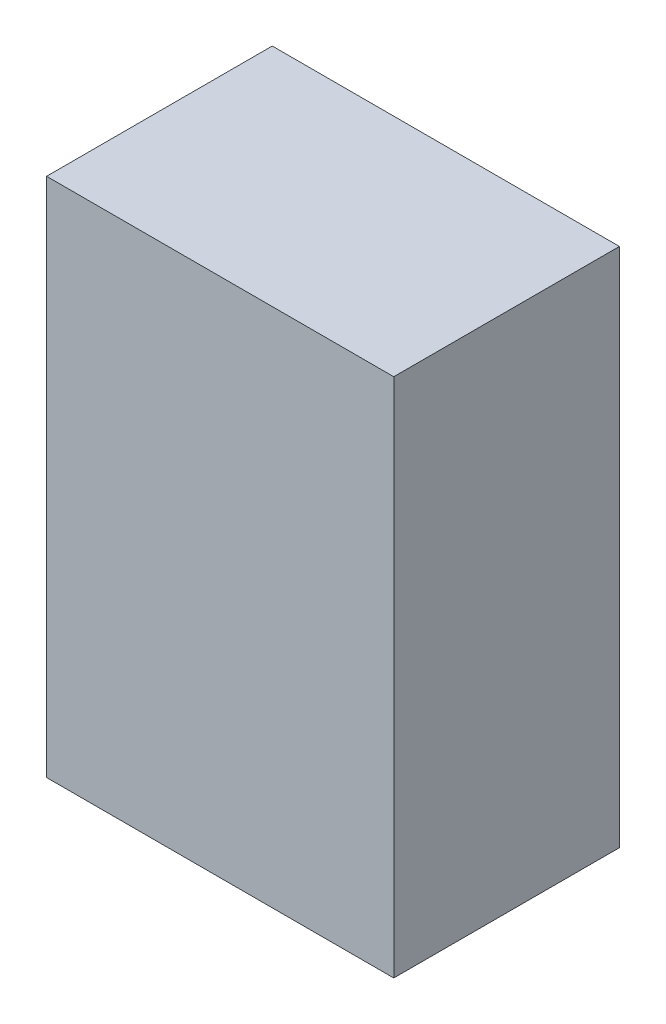
ISO-10303-21;
HEADER;
FILE_DESCRIPTION(('STEP AP214'),'2;1');
FILE_NAME('part.step','',(''),(''),'','','');
FILE_SCHEMA(('AUTOMOTIVE_DESIGN { 1 0 10303 214 1 1 1 1 }'));
ENDSEC;
DATA;
#1=APPLICATION_CONTEXT('core data for automotive mechanical design processes');
#2=APPLICATION_PROTOCOL_DEFINITION('international standard','automotive_design',2000,#1);
#3=PRODUCT_CONTEXT('',#1,'mechanical');
#4=PRODUCT('Part','Part','',(#3));
#5=PRODUCT_RELATED_PRODUCT_CATEGORY('part','',(#4));
#6=PRODUCT_DEFINITION_FORMATION('','',#4);
#7=PRODUCT_DEFINITION_CONTEXT('part definition',#1,'design');
#8=PRODUCT_DEFINITION('design','',#6,#7);
#9=PRODUCT_DEFINITION_SHAPE('','',#8);
#10=(LENGTH_UNIT() NAMED_UNIT(*) SI_UNIT(.MILLI.,.METRE.));
#11=(NAMED_UNIT(*) PLANE_ANGLE_UNIT() SI_UNIT($,.RADIAN.));
#12=(NAMED_UNIT(*) SI_UNIT($,.STERADIAN.) SOLID_ANGLE_UNIT());
#13=UNCERTAINTY_MEASURE_WITH_UNIT(LENGTH_MEASURE(1.E-05),#10,'distance_accuracy_value','');
#14=(GEOMETRIC_REPRESENTATION_CONTEXT(3) GLOBAL_UNCERTAINTY_ASSIGNED_CONTEXT((#13)) GLOBAL_UNIT_ASSIGNED_CONTEXT((#10,
#11,#12)) REPRESENTATION_CONTEXT('',''));
#15=CARTESIAN_POINT('',(0.,0.,0.));
#16=DIRECTION('',(0.,0.,1.));
#17=DIRECTION('',(1.,0.,0.));
#18=AXIS2_PLACEMENT_3D('',#15,#16,#17);
#19=CARTESIAN_POINT('',(86.36,54.6099999999733,-0.13));
#20=DIRECTION('',(0.,-2.05103306050651E-10,-1.));
#21=DIRECTION('',(0.,1.,-2.05103306050651E-10));
#22=AXIS2_PLACEMENT_3D('',#19,#20,#21);
#23=PLANE('',#22);
#24=DIRECTION('',(1.,0.,0.));
#25=VECTOR('',#24,1.);
#26=CARTESIAN_POINT('',(85.76,54.1099999999733,-0.129999999897448));
#27=LINE('',#26,#25);
#28=CARTESIAN_POINT('',(85.96,54.1099999999733,-0.129999999866683));
#29=VERTEX_POINT('',#28);
#30=CARTESIAN_POINT('',(85.76,54.10999999998,-0.129999999897448));
#31=VERTEX_POINT('',#30);
#32=EDGE_CURVE('E68',#29,#31,#27,.F.);
#33=ORIENTED_EDGE('',*,*,#32,.F.);
#34=DIRECTION('',(0.,1.,0.));
#35=VECTOR('',#34,1.);
#36=CARTESIAN_POINT('',(85.96,54.11,-0.129999999835917));
#37=LINE('',#36,#35);
#38=CARTESIAN_POINT('',(85.96,53.80999999998,-0.129999999835917));
#39=VERTEX_POINT('',#38);
#40=EDGE_CURVE('E20',#39,#29,#37,.T.);
#41=ORIENTED_EDGE('',*,*,#40,.F.);
#42=DIRECTION('',(1.,0.,0.));
#43=VECTOR('',#42,1.);
#44=CARTESIAN_POINT('',(85.96,53.8099999999733,-0.129999999835917));
#45=LINE('',#44,#43);
#46=CARTESIAN_POINT('',(85.76,53.8099999999733,-0.1299999998513));
#47=VERTEX_POINT('',#46);
#48=EDGE_CURVE('E58',#47,#39,#45,.T.);
#49=ORIENTED_EDGE('',*,*,#48,.F.);
#50=DIRECTION('',(0.,-1.,0.));
#51=VECTOR('',#50,1.);
#52=CARTESIAN_POINT('',(85.76,53.81,-0.129999999897448));
#53=LINE('',#52,#51);
#54=EDGE_CURVE('E53',#31,#47,#53,.T.);
#55=ORIENTED_EDGE('',*,*,#54,.F.);
#56=EDGE_LOOP('',(#33,#41,#49,#55));
#57=FACE_BOUND('',#56,.T.);
#58=ADVANCED_FACE('F17',(#57),#23,.T.);
#59=CARTESIAN_POINT('',(85.96,54.11,1.02551653025326E-10));
#60=DIRECTION('',(1.,0.,0.));
#61=DIRECTION('',(0.,1.,0.));
#62=AXIS2_PLACEMENT_3D('',#59,#60,#61);
#63=PLANE('',#62);
#64=DIRECTION('',(0.,2.05103306050651E-10,1.));
#65=VECTOR('',#64,1.);
#66=CARTESIAN_POINT('',(85.96,54.11,1.02551653025326E-10));
#67=LINE('',#66,#65);
#68=CARTESIAN_POINT('',(85.96,54.1099999999866,1.02551653025326E-10));
#69=VERTEX_POINT('',#68);
#70=EDGE_CURVE('E79',#69,#29,#67,.F.);
#71=ORIENTED_EDGE('',*,*,#70,.F.);
#72=DIRECTION('',(0.,1.,-2.05103306050651E-10));
#73=VECTOR('',#72,1.);
#74=CARTESIAN_POINT('',(85.96,54.61,0.));
#75=LINE('',#74,#73);
#76=CARTESIAN_POINT('',(85.96,53.81,1.33317148932923E-10));
#77=VERTEX_POINT('',#76);
#78=EDGE_CURVE('E74',#69,#77,#75,.F.);
#79=ORIENTED_EDGE('',*,*,#78,.T.);
#80=DIRECTION('',(0.,-2.05103306050651E-10,-1.));
#81=VECTOR('',#80,1.);
#82=CARTESIAN_POINT('',(85.96,53.81,1.64082644840521E-10));
#83=LINE('',#82,#81);
#84=EDGE_CURVE('E63',#39,#77,#83,.F.);
#85=ORIENTED_EDGE('',*,*,#84,.F.);
#86=ORIENTED_EDGE('',*,*,#40,.T.);
#87=EDGE_LOOP('',(#71,#79,#85,#86));
#88=FACE_BOUND('',#87,.T.);
#89=ADVANCED_FACE('F73',(#88),#63,.T.);
#90=CARTESIAN_POINT('',(85.96,53.81,1.64082644840521E-10));
#91=DIRECTION('',(0.,-1.,2.05103306050651E-10));
#92=DIRECTION('',(0.,-2.05103306050651E-10,-1.));
#93=AXIS2_PLACEMENT_3D('',#90,#91,#92);
#94=PLANE('',#93);
#95=ORIENTED_EDGE('',*,*,#84,.T.);
#96=DIRECTION('',(1.,0.,0.));
#97=VECTOR('',#96,1.);
#98=CARTESIAN_POINT('',(86.36,53.81,1.6408264484052E-10));
#99=LINE('',#98,#97);
#100=CARTESIAN_POINT('',(85.76,53.8099999999933,1.64082644840521E-10));
#101=VERTEX_POINT('',#100);
#102=EDGE_CURVE('E84',#77,#101,#99,.F.);
#103=ORIENTED_EDGE('',*,*,#102,.T.);
#104=DIRECTION('',(0.,0.,1.));
#105=VECTOR('',#104,1.);
#106=CARTESIAN_POINT('',(85.76,53.8099999999733,1.64082644840521E-10));
#107=LINE('',#106,#105);
#108=EDGE_CURVE('E65',#47,#101,#107,.T.);
#109=ORIENTED_EDGE('',*,*,#108,.F.);
#110=ORIENTED_EDGE('',*,*,#48,.T.);
#111=EDGE_LOOP('',(#95,#103,#109,#110));
#112=FACE_BOUND('',#111,.T.);
#113=ADVANCED_FACE('F60',(#112),#94,.T.);
#114=CARTESIAN_POINT('',(85.76,53.81,1.64082644840521E-10));
#115=DIRECTION('',(-1.,0.,0.));
#116=DIRECTION('',(0.,-1.,0.));
#117=AXIS2_PLACEMENT_3D('',#114,#115,#116);
#118=PLANE('',#117);
#119=ORIENTED_EDGE('',*,*,#108,.T.);
#120=DIRECTION('',(0.,1.,-2.05103306050651E-10));
#121=VECTOR('',#120,1.);
#122=CARTESIAN_POINT('',(85.76,54.61,0.));
#123=LINE('',#122,#121);
#124=CARTESIAN_POINT('',(85.76,54.11,1.33317148932923E-10));
#125=VERTEX_POINT('',#124);
#126=EDGE_CURVE('E26',#101,#125,#123,.T.);
#127=ORIENTED_EDGE('',*,*,#126,.T.);
#128=DIRECTION('',(0.,2.05103306050651E-10,1.));
#129=VECTOR('',#128,1.);
#130=CARTESIAN_POINT('',(85.76,54.11,1.02551653025326E-10));
#131=LINE('',#130,#129);
#132=EDGE_CURVE('E34',#31,#125,#131,.T.);
#133=ORIENTED_EDGE('',*,*,#132,.F.);
#134=ORIENTED_EDGE('',*,*,#54,.T.);
#135=EDGE_LOOP('',(#119,#127,#133,#134));
#136=FACE_BOUND('',#135,.T.);
#137=ADVANCED_FACE('F88',(#136),#118,.T.);
#138=CARTESIAN_POINT('',(85.76,54.11,1.02551653025326E-10));
#139=DIRECTION('',(0.,1.,-2.05103306050651E-10));
#140=DIRECTION('',(0.,2.05103306050651E-10,1.));
#141=AXIS2_PLACEMENT_3D('',#138,#139,#140);
#142=PLANE('',#141);
#143=ORIENTED_EDGE('',*,*,#132,.T.);
#144=DIRECTION('',(1.,0.,0.));
#145=VECTOR('',#144,1.);
#146=CARTESIAN_POINT('',(86.36,54.11,1.02551653025326E-10));
#147=LINE('',#146,#145);
#148=EDGE_CURVE('E11',#125,#69,#147,.T.);
#149=ORIENTED_EDGE('',*,*,#148,.T.);
#150=ORIENTED_EDGE('',*,*,#70,.T.);
#151=ORIENTED_EDGE('',*,*,#32,.T.);
#152=EDGE_LOOP('',(#143,#149,#150,#151));
#153=FACE_BOUND('',#152,.T.);
#154=ADVANCED_FACE('F91',(#153),#142,.T.);
#155=CARTESIAN_POINT('',(86.36,54.61,0.));
#156=DIRECTION('',(0.,-2.05103306050651E-10,-1.));
#157=DIRECTION('',(0.,1.,-2.05103306050651E-10));
#158=AXIS2_PLACEMENT_3D('',#155,#156,#157);
#159=PLANE('',#158);
#160=ORIENTED_EDGE('',*,*,#126,.F.);
#161=ORIENTED_EDGE('',*,*,#102,.F.);
#162=ORIENTED_EDGE('',*,*,#78,.F.);
#163=ORIENTED_EDGE('',*,*,#148,.F.);
#164=EDGE_LOOP('',(#160,#161,#162,#163));
#165=FACE_BOUND('',#164,.T.);
#166=ADVANCED_FACE('F90',(#165),#159,.F.);
#167=CLOSED_SHELL('',(#58,#89,#113,#137,#154,#166));
#168=MANIFOLD_SOLID_BREP('B1',#167);
#169=ADVANCED_BREP_SHAPE_REPRESENTATION('',(#18,#168),#14);
#170=SHAPE_DEFINITION_REPRESENTATION(#9,#169);
ENDSEC;
END-ISO-10303-21;
